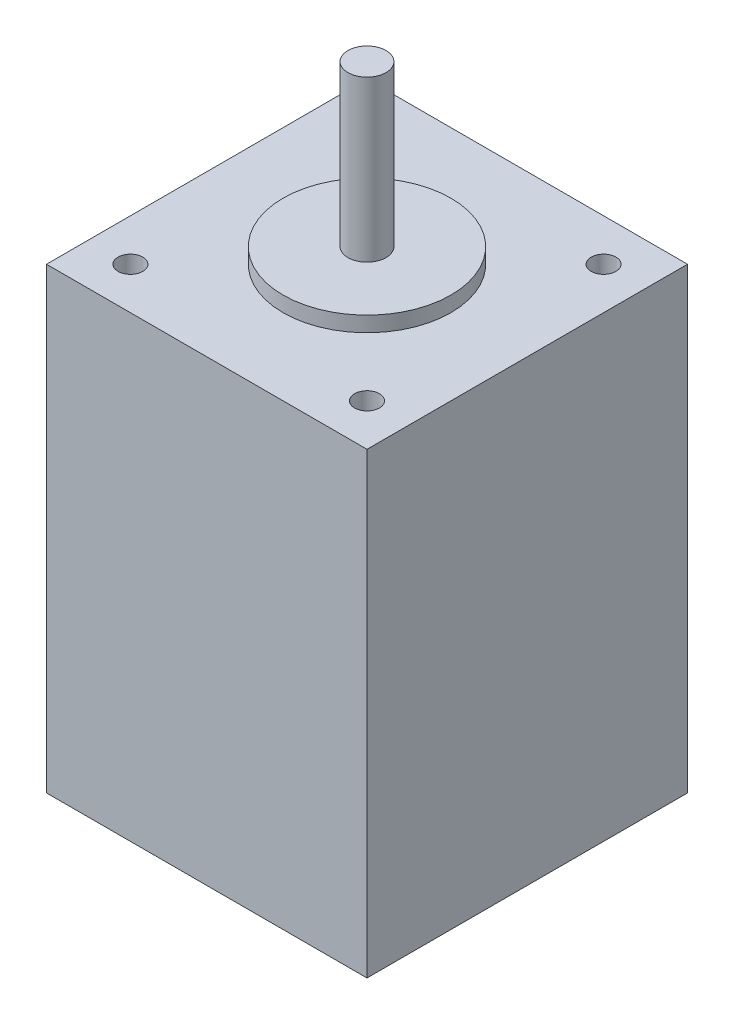
ISO-10303-21;
HEADER;
FILE_DESCRIPTION(('STEP AP214'),'2;1');
FILE_NAME('part.step','',(''),(''),'','','');
FILE_SCHEMA(('AUTOMOTIVE_DESIGN { 1 0 10303 214 1 1 1 1 }'));
ENDSEC;
DATA;
#1=APPLICATION_CONTEXT('core data for automotive mechanical design processes');
#2=APPLICATION_PROTOCOL_DEFINITION('international standard','automotive_design',2000,#1);
#3=PRODUCT_CONTEXT('',#1,'mechanical');
#4=PRODUCT('Part','Part','',(#3));
#5=PRODUCT_RELATED_PRODUCT_CATEGORY('part','',(#4));
#6=PRODUCT_DEFINITION_FORMATION('','',#4);
#7=PRODUCT_DEFINITION_CONTEXT('part definition',#1,'design');
#8=PRODUCT_DEFINITION('design','',#6,#7);
#9=PRODUCT_DEFINITION_SHAPE('','',#8);
#10=(LENGTH_UNIT() NAMED_UNIT(*) SI_UNIT(.MILLI.,.METRE.));
#11=(NAMED_UNIT(*) PLANE_ANGLE_UNIT() SI_UNIT($,.RADIAN.));
#12=(NAMED_UNIT(*) SI_UNIT($,.STERADIAN.) SOLID_ANGLE_UNIT());
#13=UNCERTAINTY_MEASURE_WITH_UNIT(LENGTH_MEASURE(1.E-05),#10,'distance_accuracy_value','');
#14=(GEOMETRIC_REPRESENTATION_CONTEXT(3) GLOBAL_UNCERTAINTY_ASSIGNED_CONTEXT((#13)) GLOBAL_UNIT_ASSIGNED_CONTEXT((#10,
#11,#12)) REPRESENTATION_CONTEXT('',''));
#15=CARTESIAN_POINT('',(0.,0.,0.));
#16=DIRECTION('',(0.,0.,1.));
#17=DIRECTION('',(1.,0.,0.));
#18=AXIS2_PLACEMENT_3D('',#15,#16,#17);
#19=CARTESIAN_POINT('',(0.,60.,0.));
#20=DIRECTION('',(1.,0.,0.));
#21=DIRECTION('',(0.,0.,-1.));
#22=AXIS2_PLACEMENT_3D('',#19,#20,#21);
#23=PLANE('',#22);
#24=DIRECTION('',(0.,0.,1.));
#25=VECTOR('',#24,1.);
#26=CARTESIAN_POINT('',(0.,0.,0.));
#27=LINE('',#26,#25);
#28=CARTESIAN_POINT('',(0.,0.,-42.));
#29=VERTEX_POINT('',#28);
#30=CARTESIAN_POINT('',(0.,0.,0.));
#31=VERTEX_POINT('',#30);
#32=EDGE_CURVE('E100',#29,#31,#27,.T.);
#33=ORIENTED_EDGE('',*,*,#32,.T.);
#34=DIRECTION('',(0.,-1.,0.));
#35=VECTOR('',#34,1.);
#36=CARTESIAN_POINT('',(0.,60.,0.));
#37=LINE('',#36,#35);
#38=CARTESIAN_POINT('',(0.,60.,0.));
#39=VERTEX_POINT('',#38);
#40=EDGE_CURVE('E36',#39,#31,#37,.T.);
#41=ORIENTED_EDGE('',*,*,#40,.F.);
#42=DIRECTION('',(0.,0.,1.));
#43=VECTOR('',#42,1.);
#44=CARTESIAN_POINT('',(0.,60.,0.));
#45=LINE('',#44,#43);
#46=CARTESIAN_POINT('',(0.,60.,-42.));
#47=VERTEX_POINT('',#46);
#48=EDGE_CURVE('E87',#47,#39,#45,.T.);
#49=ORIENTED_EDGE('',*,*,#48,.F.);
#50=DIRECTION('',(0.,-1.,0.));
#51=VECTOR('',#50,1.);
#52=CARTESIAN_POINT('',(0.,60.,-42.));
#53=LINE('',#52,#51);
#54=EDGE_CURVE('E96',#47,#29,#53,.T.);
#55=ORIENTED_EDGE('',*,*,#54,.T.);
#56=EDGE_LOOP('',(#33,#41,#49,#55));
#57=FACE_BOUND('',#56,.T.);
#58=ADVANCED_FACE('F33',(#57),#23,.F.);
#59=CARTESIAN_POINT('',(0.,60.,0.));
#60=DIRECTION('',(0.,0.,-1.));
#61=DIRECTION('',(-1.,0.,0.));
#62=AXIS2_PLACEMENT_3D('',#59,#60,#61);
#63=PLANE('',#62);
#64=DIRECTION('',(1.,0.,0.));
#65=VECTOR('',#64,1.);
#66=CARTESIAN_POINT('',(0.,0.,0.));
#67=LINE('',#66,#65);
#68=CARTESIAN_POINT('',(42.,0.,0.));
#69=VERTEX_POINT('',#68);
#70=EDGE_CURVE('E92',#31,#69,#67,.T.);
#71=ORIENTED_EDGE('',*,*,#70,.T.);
#72=DIRECTION('',(0.,-1.,0.));
#73=VECTOR('',#72,1.);
#74=CARTESIAN_POINT('',(42.,60.,0.));
#75=LINE('',#74,#73);
#76=CARTESIAN_POINT('',(42.,60.,0.));
#77=VERTEX_POINT('',#76);
#78=EDGE_CURVE('E90',#77,#69,#75,.T.);
#79=ORIENTED_EDGE('',*,*,#78,.F.);
#80=DIRECTION('',(1.,0.,0.));
#81=VECTOR('',#80,1.);
#82=CARTESIAN_POINT('',(0.,60.,0.));
#83=LINE('',#82,#81);
#84=EDGE_CURVE('E82',#39,#77,#83,.T.);
#85=ORIENTED_EDGE('',*,*,#84,.F.);
#86=ORIENTED_EDGE('',*,*,#40,.T.);
#87=EDGE_LOOP('',(#71,#79,#85,#86));
#88=FACE_BOUND('',#87,.T.);
#89=ADVANCED_FACE('F91',(#88),#63,.F.);
#90=CARTESIAN_POINT('',(42.,60.,0.));
#91=DIRECTION('',(-1.,0.,0.));
#92=DIRECTION('',(0.,0.,1.));
#93=AXIS2_PLACEMENT_3D('',#90,#91,#92);
#94=PLANE('',#93);
#95=DIRECTION('',(0.,0.,-1.));
#96=VECTOR('',#95,1.);
#97=CARTESIAN_POINT('',(42.,0.,0.));
#98=LINE('',#97,#96);
#99=CARTESIAN_POINT('',(42.,0.,-42.));
#100=VERTEX_POINT('',#99);
#101=EDGE_CURVE('E68',#69,#100,#98,.T.);
#102=ORIENTED_EDGE('',*,*,#101,.T.);
#103=DIRECTION('',(0.,-1.,0.));
#104=VECTOR('',#103,1.);
#105=CARTESIAN_POINT('',(42.,60.,-42.));
#106=LINE('',#105,#104);
#107=CARTESIAN_POINT('',(42.,60.,-42.));
#108=VERTEX_POINT('',#107);
#109=EDGE_CURVE('E93',#108,#100,#106,.T.);
#110=ORIENTED_EDGE('',*,*,#109,.F.);
#111=DIRECTION('',(0.,0.,-1.));
#112=VECTOR('',#111,1.);
#113=CARTESIAN_POINT('',(42.,60.,0.));
#114=LINE('',#113,#112);
#115=EDGE_CURVE('E85',#77,#108,#114,.T.);
#116=ORIENTED_EDGE('',*,*,#115,.F.);
#117=ORIENTED_EDGE('',*,*,#78,.T.);
#118=EDGE_LOOP('',(#102,#110,#116,#117));
#119=FACE_BOUND('',#118,.T.);
#120=ADVANCED_FACE('F94',(#119),#94,.F.);
#121=CARTESIAN_POINT('',(0.,60.,-42.));
#122=DIRECTION('',(0.,0.,1.));
#123=DIRECTION('',(1.,0.,0.));
#124=AXIS2_PLACEMENT_3D('',#121,#122,#123);
#125=PLANE('',#124);
#126=DIRECTION('',(-1.,0.,0.));
#127=VECTOR('',#126,1.);
#128=CARTESIAN_POINT('',(0.,0.,-42.));
#129=LINE('',#128,#127);
#130=EDGE_CURVE('E74',#100,#29,#129,.T.);
#131=ORIENTED_EDGE('',*,*,#130,.T.);
#132=ORIENTED_EDGE('',*,*,#54,.F.);
#133=DIRECTION('',(-1.,0.,0.));
#134=VECTOR('',#133,1.);
#135=CARTESIAN_POINT('',(0.,60.,-42.));
#136=LINE('',#135,#134);
#137=EDGE_CURVE('E51',#108,#47,#136,.T.);
#138=ORIENTED_EDGE('',*,*,#137,.F.);
#139=ORIENTED_EDGE('',*,*,#109,.T.);
#140=EDGE_LOOP('',(#131,#132,#138,#139));
#141=FACE_BOUND('',#140,.T.);
#142=ADVANCED_FACE('F108',(#141),#125,.F.);
#143=CARTESIAN_POINT('',(0.,60.,0.));
#144=DIRECTION('',(0.,-1.,0.));
#145=DIRECTION('',(0.,0.,-1.));
#146=AXIS2_PLACEMENT_3D('',#143,#144,#145);
#147=PLANE('',#146);
#148=CARTESIAN_POINT('',(5.50000000000001,60.,-5.50000000000001));
#149=DIRECTION('',(0.,1.,0.));
#150=DIRECTION('',(0.,0.,1.));
#151=AXIS2_PLACEMENT_3D('',#148,#149,#150);
#152=CIRCLE('',#151,1.625);
#153=CARTESIAN_POINT('',(5.50000000000001,60.,-3.875));
#154=VERTEX_POINT('',#153);
#155=EDGE_CURVE('E128',#154,#154,#152,.T.);
#156=ORIENTED_EDGE('',*,*,#155,.F.);
#157=EDGE_LOOP('',(#156));
#158=FACE_BOUND('',#157,.T.);
#159=CARTESIAN_POINT('',(36.5,60.,-5.50000000000001));
#160=DIRECTION('',(0.,1.,0.));
#161=DIRECTION('',(0.,0.,1.));
#162=AXIS2_PLACEMENT_3D('',#159,#160,#161);
#163=CIRCLE('',#162,1.625);
#164=CARTESIAN_POINT('',(36.5,60.,-3.875));
#165=VERTEX_POINT('',#164);
#166=EDGE_CURVE('E134',#165,#165,#163,.T.);
#167=ORIENTED_EDGE('',*,*,#166,.F.);
#168=EDGE_LOOP('',(#167));
#169=FACE_BOUND('',#168,.T.);
#170=CARTESIAN_POINT('',(36.5,60.,-36.5));
#171=DIRECTION('',(0.,1.,0.));
#172=DIRECTION('',(0.,0.,1.));
#173=AXIS2_PLACEMENT_3D('',#170,#171,#172);
#174=CIRCLE('',#173,1.625);
#175=CARTESIAN_POINT('',(36.5,60.,-34.875));
#176=VERTEX_POINT('',#175);
#177=EDGE_CURVE('E140',#176,#176,#174,.T.);
#178=ORIENTED_EDGE('',*,*,#177,.F.);
#179=EDGE_LOOP('',(#178));
#180=FACE_BOUND('',#179,.T.);
#181=CARTESIAN_POINT('',(5.50000000000001,60.,-36.5));
#182=DIRECTION('',(0.,1.,0.));
#183=DIRECTION('',(0.,0.,1.));
#184=AXIS2_PLACEMENT_3D('',#181,#182,#183);
#185=CIRCLE('',#184,1.625);
#186=CARTESIAN_POINT('',(5.50000000000001,60.,-34.875));
#187=VERTEX_POINT('',#186);
#188=EDGE_CURVE('E122',#187,#187,#185,.T.);
#189=ORIENTED_EDGE('',*,*,#188,.F.);
#190=EDGE_LOOP('',(#189));
#191=FACE_BOUND('',#190,.T.);
#192=CARTESIAN_POINT('',(21.,60.,-21.));
#193=DIRECTION('',(0.,1.,0.));
#194=DIRECTION('',(0.,0.,1.));
#195=AXIS2_PLACEMENT_3D('',#192,#193,#194);
#196=CIRCLE('',#195,11.);
#197=CARTESIAN_POINT('',(21.,60.,-10.));
#198=VERTEX_POINT('',#197);
#199=EDGE_CURVE('E42',#198,#198,#196,.T.);
#200=ORIENTED_EDGE('',*,*,#199,.F.);
#201=EDGE_LOOP('',(#200));
#202=FACE_BOUND('',#201,.T.);
#203=ORIENTED_EDGE('',*,*,#48,.T.);
#204=ORIENTED_EDGE('',*,*,#84,.T.);
#205=ORIENTED_EDGE('',*,*,#115,.T.);
#206=ORIENTED_EDGE('',*,*,#137,.T.);
#207=EDGE_LOOP('',(#203,#204,#205,#206));
#208=FACE_BOUND('',#207,.T.);
#209=ADVANCED_FACE('F83',(#158,#169,#180,#191,#202,#208),#147,.F.);
#210=CARTESIAN_POINT('',(0.,0.,0.));
#211=DIRECTION('',(0.,-1.,0.));
#212=DIRECTION('',(0.,0.,-1.));
#213=AXIS2_PLACEMENT_3D('',#210,#211,#212);
#214=PLANE('',#213);
#215=CARTESIAN_POINT('',(5.50000000000001,0.,-5.50000000000001));
#216=DIRECTION('',(0.,1.,0.));
#217=DIRECTION('',(0.,0.,1.));
#218=AXIS2_PLACEMENT_3D('',#215,#216,#217);
#219=CIRCLE('',#218,1.625);
#220=CARTESIAN_POINT('',(5.50000000000001,0.,-3.875));
#221=VERTEX_POINT('',#220);
#222=EDGE_CURVE('E131',#221,#221,#219,.T.);
#223=ORIENTED_EDGE('',*,*,#222,.T.);
#224=EDGE_LOOP('',(#223));
#225=FACE_BOUND('',#224,.T.);
#226=CARTESIAN_POINT('',(36.5,0.,-5.50000000000001));
#227=DIRECTION('',(0.,1.,0.));
#228=DIRECTION('',(0.,0.,1.));
#229=AXIS2_PLACEMENT_3D('',#226,#227,#228);
#230=CIRCLE('',#229,1.625);
#231=CARTESIAN_POINT('',(36.5,0.,-3.875));
#232=VERTEX_POINT('',#231);
#233=EDGE_CURVE('E137',#232,#232,#230,.T.);
#234=ORIENTED_EDGE('',*,*,#233,.T.);
#235=EDGE_LOOP('',(#234));
#236=FACE_BOUND('',#235,.T.);
#237=CARTESIAN_POINT('',(36.5,0.,-36.5));
#238=DIRECTION('',(0.,1.,0.));
#239=DIRECTION('',(0.,0.,1.));
#240=AXIS2_PLACEMENT_3D('',#237,#238,#239);
#241=CIRCLE('',#240,1.625);
#242=CARTESIAN_POINT('',(36.5,0.,-34.875));
#243=VERTEX_POINT('',#242);
#244=EDGE_CURVE('E125',#243,#243,#241,.T.);
#245=ORIENTED_EDGE('',*,*,#244,.T.);
#246=EDGE_LOOP('',(#245));
#247=FACE_BOUND('',#246,.T.);
#248=CARTESIAN_POINT('',(5.50000000000001,0.,-36.5));
#249=DIRECTION('',(0.,1.,0.));
#250=DIRECTION('',(0.,0.,1.));
#251=AXIS2_PLACEMENT_3D('',#248,#249,#250);
#252=CIRCLE('',#251,1.625);
#253=CARTESIAN_POINT('',(5.50000000000001,0.,-34.875));
#254=VERTEX_POINT('',#253);
#255=EDGE_CURVE('E121',#254,#254,#252,.T.);
#256=ORIENTED_EDGE('',*,*,#255,.T.);
#257=EDGE_LOOP('',(#256));
#258=FACE_BOUND('',#257,.T.);
#259=ORIENTED_EDGE('',*,*,#32,.F.);
#260=ORIENTED_EDGE('',*,*,#130,.F.);
#261=ORIENTED_EDGE('',*,*,#101,.F.);
#262=ORIENTED_EDGE('',*,*,#70,.F.);
#263=EDGE_LOOP('',(#259,#260,#261,#262));
#264=FACE_BOUND('',#263,.T.);
#265=ADVANCED_FACE('F111',(#225,#236,#247,#258,#264),#214,.T.);
#266=CARTESIAN_POINT('',(21.,62.,-21.));
#267=DIRECTION('',(0.,-1.,0.));
#268=DIRECTION('',(0.,0.,-1.));
#269=AXIS2_PLACEMENT_3D('',#266,#267,#268);
#270=CYLINDRICAL_SURFACE('',#269,11.);
#271=CARTESIAN_POINT('',(21.,62.,-21.));
#272=DIRECTION('',(0.,1.,0.));
#273=DIRECTION('',(0.,0.,1.));
#274=AXIS2_PLACEMENT_3D('',#271,#272,#273);
#275=CIRCLE('',#274,11.);
#276=CARTESIAN_POINT('',(21.,62.,-10.));
#277=VERTEX_POINT('',#276);
#278=EDGE_CURVE('E103',#277,#277,#275,.T.);
#279=ORIENTED_EDGE('',*,*,#278,.F.);
#280=EDGE_LOOP('',(#279));
#281=FACE_BOUND('',#280,.T.);
#282=ORIENTED_EDGE('',*,*,#199,.T.);
#283=EDGE_LOOP('',(#282));
#284=FACE_BOUND('',#283,.T.);
#285=ADVANCED_FACE('F164',(#281,#284),#270,.T.);
#286=CARTESIAN_POINT('',(21.,62.,-21.));
#287=DIRECTION('',(0.,1.,0.));
#288=DIRECTION('',(0.,0.,1.));
#289=AXIS2_PLACEMENT_3D('',#286,#287,#288);
#290=PLANE('',#289);
#291=CARTESIAN_POINT('',(21.,62.,-21.));
#292=DIRECTION('',(0.,1.,0.));
#293=DIRECTION('',(0.,0.,1.));
#294=AXIS2_PLACEMENT_3D('',#291,#292,#293);
#295=CIRCLE('',#294,2.5);
#296=CARTESIAN_POINT('',(21.,62.,-23.5));
#297=VERTEX_POINT('',#296);
#298=EDGE_CURVE('E11',#297,#297,#295,.T.);
#299=ORIENTED_EDGE('',*,*,#298,.F.);
#300=EDGE_LOOP('',(#299));
#301=FACE_BOUND('',#300,.T.);
#302=ORIENTED_EDGE('',*,*,#278,.T.);
#303=EDGE_LOOP('',(#302));
#304=FACE_BOUND('',#303,.T.);
#305=ADVANCED_FACE('F166',(#301,#304),#290,.T.);
#306=CARTESIAN_POINT('',(21.,83.,-21.));
#307=DIRECTION('',(0.,-1.,0.));
#308=DIRECTION('',(0.,0.,-1.));
#309=AXIS2_PLACEMENT_3D('',#306,#307,#308);
#310=CYLINDRICAL_SURFACE('',#309,2.5);
#311=CARTESIAN_POINT('',(21.,83.,-21.));
#312=DIRECTION('',(0.,1.,0.));
#313=DIRECTION('',(0.,0.,1.));
#314=AXIS2_PLACEMENT_3D('',#311,#312,#313);
#315=CIRCLE('',#314,2.5);
#316=CARTESIAN_POINT('',(21.,83.,-23.5));
#317=VERTEX_POINT('',#316);
#318=EDGE_CURVE('E117',#317,#317,#315,.T.);
#319=CARTESIAN_POINT('',(21.,83.,-23.5));
#320=CARTESIAN_POINT('',(21.,82.78125,-23.5));
#321=CARTESIAN_POINT('',(21.,82.5625,-23.5));
#322=CARTESIAN_POINT('',(21.,82.125,-23.5));
#323=CARTESIAN_POINT('',(21.,81.90625,-23.5));
#324=CARTESIAN_POINT('',(21.,81.46875,-23.5));
#325=CARTESIAN_POINT('',(21.,81.25,-23.5));
#326=CARTESIAN_POINT('',(21.,80.8125,-23.5));
#327=CARTESIAN_POINT('',(21.,80.59375,-23.5));
#328=CARTESIAN_POINT('',(21.,80.15625,-23.5));
#329=CARTESIAN_POINT('',(21.,79.9375,-23.5));
#330=CARTESIAN_POINT('',(21.,79.5,-23.5));
#331=CARTESIAN_POINT('',(21.,79.28125,-23.5));
#332=CARTESIAN_POINT('',(21.,78.84375,-23.5));
#333=CARTESIAN_POINT('',(21.,78.625,-23.5));
#334=CARTESIAN_POINT('',(21.,78.1875,-23.5));
#335=CARTESIAN_POINT('',(21.,77.96875,-23.5));
#336=CARTESIAN_POINT('',(21.,77.53125,-23.5));
#337=CARTESIAN_POINT('',(21.,77.3125,-23.5));
#338=CARTESIAN_POINT('',(21.,76.875,-23.5));
#339=CARTESIAN_POINT('',(21.,76.65625,-23.5));
#340=CARTESIAN_POINT('',(21.,76.21875,-23.5));
#341=CARTESIAN_POINT('',(21.,76.,-23.5));
#342=CARTESIAN_POINT('',(21.,75.5625,-23.5));
#343=CARTESIAN_POINT('',(21.,75.34375,-23.5));
#344=CARTESIAN_POINT('',(21.,74.90625,-23.5));
#345=CARTESIAN_POINT('',(21.,74.6875,-23.5));
#346=CARTESIAN_POINT('',(21.,74.25,-23.5));
#347=CARTESIAN_POINT('',(21.,74.03125,-23.5));
#348=CARTESIAN_POINT('',(21.,73.59375,-23.5));
#349=CARTESIAN_POINT('',(21.,73.375,-23.5));
#350=CARTESIAN_POINT('',(21.,72.9375,-23.5));
#351=CARTESIAN_POINT('',(21.,72.71875,-23.5));
#352=CARTESIAN_POINT('',(21.,72.28125,-23.5));
#353=CARTESIAN_POINT('',(21.,72.0625,-23.5));
#354=CARTESIAN_POINT('',(21.,71.625,-23.5));
#355=CARTESIAN_POINT('',(21.,71.40625,-23.5));
#356=CARTESIAN_POINT('',(21.,70.96875,-23.5));
#357=CARTESIAN_POINT('',(21.,70.75,-23.5));
#358=CARTESIAN_POINT('',(21.,70.3125,-23.5));
#359=CARTESIAN_POINT('',(21.,70.09375,-23.5));
#360=CARTESIAN_POINT('',(21.,69.65625,-23.5));
#361=CARTESIAN_POINT('',(21.,69.4375,-23.5));
#362=CARTESIAN_POINT('',(21.,69.,-23.5));
#363=CARTESIAN_POINT('',(21.,68.78125,-23.5));
#364=CARTESIAN_POINT('',(21.,68.34375,-23.5));
#365=CARTESIAN_POINT('',(21.,68.125,-23.5));
#366=CARTESIAN_POINT('',(21.,67.6875,-23.5));
#367=CARTESIAN_POINT('',(21.,67.46875,-23.5));
#368=CARTESIAN_POINT('',(21.,67.03125,-23.5));
#369=CARTESIAN_POINT('',(21.,66.8125,-23.5));
#370=CARTESIAN_POINT('',(21.,66.375,-23.5));
#371=CARTESIAN_POINT('',(21.,66.15625,-23.5));
#372=CARTESIAN_POINT('',(21.,65.71875,-23.5));
#373=CARTESIAN_POINT('',(21.,65.5,-23.5));
#374=CARTESIAN_POINT('',(21.,65.0625,-23.5));
#375=CARTESIAN_POINT('',(21.,64.84375,-23.5));
#376=CARTESIAN_POINT('',(21.,64.40625,-23.5));
#377=CARTESIAN_POINT('',(21.,64.1875,-23.5));
#378=CARTESIAN_POINT('',(21.,63.75,-23.5));
#379=CARTESIAN_POINT('',(21.,63.53125,-23.5));
#380=CARTESIAN_POINT('',(21.,63.09375,-23.5));
#381=CARTESIAN_POINT('',(21.,62.875,-23.5));
#382=CARTESIAN_POINT('',(21.,62.4375,-23.5));
#383=CARTESIAN_POINT('',(21.,62.21875,-23.5));
#384=CARTESIAN_POINT('',(21.,62.,-23.5));
#385=B_SPLINE_CURVE_WITH_KNOTS('',3,(#319,#320,#321,#322,#323,#324,#325,#326,#327,#328,#329,
#330,#331,#332,#333,#334,#335,#336,#337,#338,#339,#340,#341,#342,#343,#344,#345,#346,#347,#348,
#349,#350,#351,#352,#353,#354,#355,#356,#357,#358,#359,#360,#361,#362,#363,#364,#365,#366,#367,
#368,#369,#370,#371,#372,#373,#374,#375,#376,#377,#378,#379,#380,#381,#382,#383,#384),
.UNSPECIFIED.,.F.,.F.,(4,2,2,2,2,2,2,2,2,2,2,2,2,2,2,2,2,2,2,2,2,2,2,2,2,2,2,2,2,2,2,2,4),(0.,
0.656249999999997,1.31249999999999,1.96874999999999,2.62499999999999,3.28125,3.9375,
4.59374999999999,5.24999999999999,5.90624999999999,6.5625,7.21875,7.87499999999999,
8.53124999999999,9.18749999999999,9.84375,10.5,11.15625,11.8125,12.46875,13.125,13.78125,
14.4375,15.09375,15.75,16.40625,17.0625,17.71875,18.375,19.03125,19.6875,20.34375,21.),.UNSPECIFIED.);
#386=EDGE_CURVE('BSEAM173',#317,#297,#385,.T.);
#387=ORIENTED_EDGE('',*,*,#318,.F.);
#388=ORIENTED_EDGE('',*,*,#298,.T.);
#389=ORIENTED_EDGE('',*,*,#386,.T.);
#390=ORIENTED_EDGE('',*,*,#386,.F.);
#391=EDGE_LOOP('',(#387,#389,#388,#390));
#392=FACE_BOUND('',#391,.T.);
#393=ADVANCED_FACE('F173',(#392),#310,.T.);
#394=CARTESIAN_POINT('',(21.,83.,-21.));
#395=DIRECTION('',(0.,1.,0.));
#396=DIRECTION('',(0.,0.,1.));
#397=AXIS2_PLACEMENT_3D('',#394,#395,#396);
#398=PLANE('',#397);
#399=ORIENTED_EDGE('',*,*,#318,.T.);
#400=EDGE_LOOP('',(#399));
#401=FACE_BOUND('',#400,.T.);
#402=ADVANCED_FACE('F212',(#401),#398,.T.);
#403=CARTESIAN_POINT('',(5.50000000000001,0.,-36.5));
#404=DIRECTION('',(0.,1.,0.));
#405=DIRECTION('',(0.,0.,1.));
#406=AXIS2_PLACEMENT_3D('',#403,#404,#405);
#407=CYLINDRICAL_SURFACE('',#406,1.625);
#408=ORIENTED_EDGE('',*,*,#255,.F.);
#409=EDGE_LOOP('',(#408));
#410=FACE_BOUND('',#409,.T.);
#411=ORIENTED_EDGE('',*,*,#188,.T.);
#412=EDGE_LOOP('',(#411));
#413=FACE_BOUND('',#412,.T.);
#414=ADVANCED_FACE('F152',(#410,#413),#407,.F.);
#415=CARTESIAN_POINT('',(36.5,0.,-36.5));
#416=DIRECTION('',(0.,1.,0.));
#417=DIRECTION('',(0.,0.,1.));
#418=AXIS2_PLACEMENT_3D('',#415,#416,#417);
#419=CYLINDRICAL_SURFACE('',#418,1.625);
#420=ORIENTED_EDGE('',*,*,#244,.F.);
#421=EDGE_LOOP('',(#420));
#422=FACE_BOUND('',#421,.T.);
#423=ORIENTED_EDGE('',*,*,#177,.T.);
#424=EDGE_LOOP('',(#423));
#425=FACE_BOUND('',#424,.T.);
#426=ADVANCED_FACE('F148',(#422,#425),#419,.F.);
#427=CARTESIAN_POINT('',(36.5,0.,-5.50000000000001));
#428=DIRECTION('',(0.,1.,0.));
#429=DIRECTION('',(0.,0.,1.));
#430=AXIS2_PLACEMENT_3D('',#427,#428,#429);
#431=CYLINDRICAL_SURFACE('',#430,1.625);
#432=ORIENTED_EDGE('',*,*,#233,.F.);
#433=EDGE_LOOP('',(#432));
#434=FACE_BOUND('',#433,.T.);
#435=ORIENTED_EDGE('',*,*,#166,.T.);
#436=EDGE_LOOP('',(#435));
#437=FACE_BOUND('',#436,.T.);
#438=ADVANCED_FACE('F151',(#434,#437),#431,.F.);
#439=CARTESIAN_POINT('',(5.50000000000001,0.,-5.50000000000001));
#440=DIRECTION('',(0.,1.,0.));
#441=DIRECTION('',(0.,0.,1.));
#442=AXIS2_PLACEMENT_3D('',#439,#440,#441);
#443=CYLINDRICAL_SURFACE('',#442,1.625);
#444=ORIENTED_EDGE('',*,*,#222,.F.);
#445=EDGE_LOOP('',(#444));
#446=FACE_BOUND('',#445,.T.);
#447=ORIENTED_EDGE('',*,*,#155,.T.);
#448=EDGE_LOOP('',(#447));
#449=FACE_BOUND('',#448,.T.);
#450=ADVANCED_FACE('F230',(#446,#449),#443,.F.);
#451=CLOSED_SHELL('',(#58,#89,#120,#142,#209,#265,#285,#305,#393,#402,#414,#426,#438,#450));
#452=MANIFOLD_SOLID_BREP('B2',#451);
#453=ADVANCED_BREP_SHAPE_REPRESENTATION('',(#18,#452),#14);
#454=SHAPE_DEFINITION_REPRESENTATION(#9,#453);
ENDSEC;
END-ISO-10303-21;
